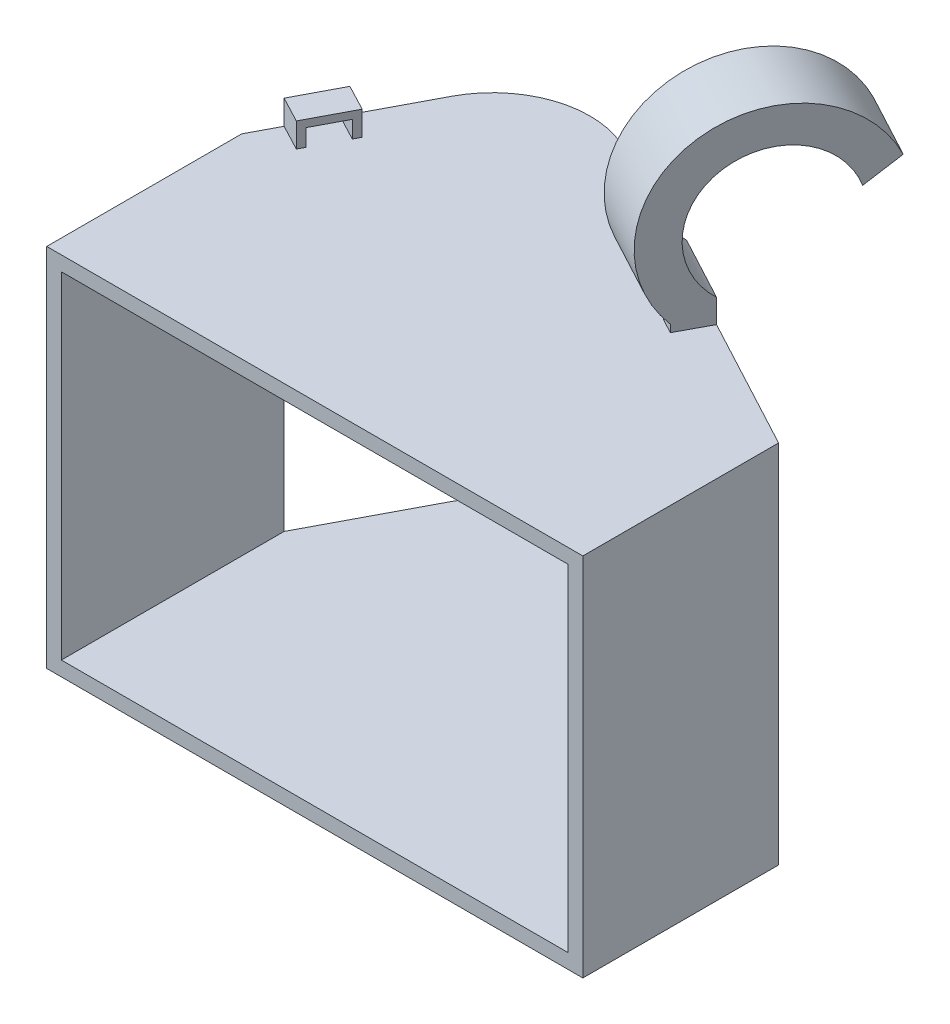
ISO-10303-21;
HEADER;
FILE_DESCRIPTION(('STEP AP214'),'2;1');
FILE_NAME('part.step','',(''),(''),'','','');
FILE_SCHEMA(('AUTOMOTIVE_DESIGN { 1 0 10303 214 1 1 1 1 }'));
ENDSEC;
DATA;
#1=APPLICATION_CONTEXT('core data for automotive mechanical design processes');
#2=APPLICATION_PROTOCOL_DEFINITION('international standard','automotive_design',2000,#1);
#3=PRODUCT_CONTEXT('',#1,'mechanical');
#4=PRODUCT('Part','Part','',(#3));
#5=PRODUCT_RELATED_PRODUCT_CATEGORY('part','',(#4));
#6=PRODUCT_DEFINITION_FORMATION('','',#4);
#7=PRODUCT_DEFINITION_CONTEXT('part definition',#1,'design');
#8=PRODUCT_DEFINITION('design','',#6,#7);
#9=PRODUCT_DEFINITION_SHAPE('','',#8);
#10=(LENGTH_UNIT() NAMED_UNIT(*) SI_UNIT(.MILLI.,.METRE.));
#11=(NAMED_UNIT(*) PLANE_ANGLE_UNIT() SI_UNIT($,.RADIAN.));
#12=(NAMED_UNIT(*) SI_UNIT($,.STERADIAN.) SOLID_ANGLE_UNIT());
#13=UNCERTAINTY_MEASURE_WITH_UNIT(LENGTH_MEASURE(1.E-05),#10,'distance_accuracy_value','');
#14=(GEOMETRIC_REPRESENTATION_CONTEXT(3) GLOBAL_UNCERTAINTY_ASSIGNED_CONTEXT((#13)) GLOBAL_UNIT_ASSIGNED_CONTEXT((#10,
#11,#12)) REPRESENTATION_CONTEXT('',''));
#15=CARTESIAN_POINT('',(0.,0.,0.));
#16=DIRECTION('',(0.,0.,1.));
#17=DIRECTION('',(1.,0.,0.));
#18=AXIS2_PLACEMENT_3D('',#15,#16,#17);
#19=CARTESIAN_POINT('',(-28.9686744744535,3.,-41.2167141231442));
#20=DIRECTION('',(0.,1.,0.));
#21=DIRECTION('',(1.,0.,0.));
#22=AXIS2_PLACEMENT_3D('',#19,#20,#21);
#23=PLANE('',#22);
#24=DIRECTION('',(0.,0.,1.));
#25=VECTOR('',#24,1.);
#26=CARTESIAN_POINT('',(-58.5267086711191,3.,-22.2982702566472));
#27=LINE('',#26,#25);
#28=CARTESIAN_POINT('',(-58.5267086711191,3.,-27.9982702566472));
#29=VERTEX_POINT('',#28);
#30=CARTESIAN_POINT('',(-58.5267086711191,3.,17.7017297433528));
#31=VERTEX_POINT('',#30);
#32=EDGE_CURVE('E331',#29,#31,#27,.T.);
#33=ORIENTED_EDGE('',*,*,#32,.T.);
#34=DIRECTION('',(1.,0.,0.));
#35=VECTOR('',#34,1.);
#36=CARTESIAN_POINT('',(-28.9686744744534,3.,17.7017297433528));
#37=LINE('',#36,#35);
#38=CARTESIAN_POINT('',(45.4732913288809,3.,17.7017297433528));
#39=VERTEX_POINT('',#38);
#40=EDGE_CURVE('E51',#31,#39,#37,.T.);
#41=ORIENTED_EDGE('',*,*,#40,.T.);
#42=DIRECTION('',(0.,0.,-1.));
#43=VECTOR('',#42,1.);
#44=CARTESIAN_POINT('',(45.4732913288809,3.,27.7017297433528));
#45=LINE('',#44,#43);
#46=CARTESIAN_POINT('',(45.4732913288809,3.,-24.0679370185461));
#47=VERTEX_POINT('',#46);
#48=EDGE_CURVE('E514',#39,#47,#45,.T.);
#49=ORIENTED_EDGE('',*,*,#48,.T.);
#50=DIRECTION('',(-0.881715494773685,0.,-0.471781502685296));
#51=VECTOR('',#50,1.);
#52=CARTESIAN_POINT('',(48.4732913288809,3.,-22.4627202377985));
#53=LINE('',#52,#51);
#54=CARTESIAN_POINT('',(-19.5330444207476,3.,-58.8510240186179));
#55=VERTEX_POINT('',#54);
#56=EDGE_CURVE('E386',#47,#55,#53,.T.);
#57=ORIENTED_EDGE('',*,*,#56,.T.);
#58=CARTESIAN_POINT('',(-28.9686744744535,3.,-41.2167141231442));
#59=DIRECTION('',(0.,1.,0.));
#60=DIRECTION('',(0.,0.,1.));
#61=AXIS2_PLACEMENT_3D('',#58,#59,#60);
#62=CIRCLE('',#61,20.);
#63=CARTESIAN_POINT('',(-28.9686744744535,3.,-61.2167141231442));
#64=VERTEX_POINT('',#63);
#65=EDGE_CURVE('E382',#55,#64,#62,.T.);
#66=ORIENTED_EDGE('',*,*,#65,.T.);
#67=CARTESIAN_POINT('',(-28.9686744744535,3.,-41.2167141231442));
#68=DIRECTION('',(0.,1.,0.));
#69=DIRECTION('',(0.,0.,1.));
#70=AXIS2_PLACEMENT_3D('',#67,#68,#69);
#71=CIRCLE('',#70,20.);
#72=CARTESIAN_POINT('',(-46.6670389220931,3.,-50.5316427797967));
#73=VERTEX_POINT('',#72);
#74=EDGE_CURVE('E413',#64,#73,#71,.T.);
#75=ORIENTED_EDGE('',*,*,#74,.T.);
#76=DIRECTION('',(-0.465746432832623,0.,0.884918222381982));
#77=VECTOR('',#76,1.);
#78=CARTESIAN_POINT('',(-46.6670389220931,3.,-50.5316427797967));
#79=LINE('',#78,#77);
#80=EDGE_CURVE('E397',#73,#29,#79,.T.);
#81=ORIENTED_EDGE('',*,*,#80,.T.);
#82=EDGE_LOOP('',(#33,#41,#49,#57,#66,#75,#81));
#83=FACE_BOUND('',#82,.T.);
#84=ADVANCED_FACE('F36',(#83),#23,.T.);
#85=CARTESIAN_POINT('',(-28.9686744744535,72.,-41.2167141231442));
#86=DIRECTION('',(0.,1.,0.));
#87=DIRECTION('',(1.,0.,0.));
#88=AXIS2_PLACEMENT_3D('',#85,#86,#87);
#89=PLANE('',#88);
#90=DIRECTION('',(1.,0.,0.));
#91=VECTOR('',#90,1.);
#92=CARTESIAN_POINT('',(-28.9686744744534,72.,17.7017297433528));
#93=LINE('',#92,#91);
#94=CARTESIAN_POINT('',(-58.5267086711191,72.,17.7017297433528));
#95=VERTEX_POINT('',#94);
#96=CARTESIAN_POINT('',(45.4732913288809,72.,17.7017297433528));
#97=VERTEX_POINT('',#96);
#98=EDGE_CURVE('E1133',#95,#97,#93,.T.);
#99=ORIENTED_EDGE('',*,*,#98,.F.);
#100=DIRECTION('',(0.,0.,1.));
#101=VECTOR('',#100,1.);
#102=CARTESIAN_POINT('',(-58.5267086711191,72.,-22.2982702566472));
#103=LINE('',#102,#101);
#104=CARTESIAN_POINT('',(-58.5267086711191,72.,-27.9982702566472));
#105=VERTEX_POINT('',#104);
#106=EDGE_CURVE('E511',#105,#95,#103,.T.);
#107=ORIENTED_EDGE('',*,*,#106,.F.);
#108=DIRECTION('',(-0.465746432832623,0.,0.884918222381982));
#109=VECTOR('',#108,1.);
#110=CARTESIAN_POINT('',(-46.6670389220931,72.,-50.5316427797967));
#111=LINE('',#110,#109);
#112=CARTESIAN_POINT('',(-46.6670389220931,72.,-50.5316427797967));
#113=VERTEX_POINT('',#112);
#114=EDGE_CURVE('E398',#113,#105,#111,.T.);
#115=ORIENTED_EDGE('',*,*,#114,.F.);
#116=CARTESIAN_POINT('',(-28.9686744744535,72.,-41.2167141231442));
#117=DIRECTION('',(0.,1.,0.));
#118=DIRECTION('',(0.,0.,1.));
#119=AXIS2_PLACEMENT_3D('',#116,#117,#118);
#120=CIRCLE('',#119,20.);
#121=CARTESIAN_POINT('',(-28.9686744744535,72.,-61.2167141231442));
#122=VERTEX_POINT('',#121);
#123=EDGE_CURVE('E414',#122,#113,#120,.T.);
#124=ORIENTED_EDGE('',*,*,#123,.F.);
#125=CARTESIAN_POINT('',(-28.9686744744535,72.,-41.2167141231442));
#126=DIRECTION('',(0.,1.,0.));
#127=DIRECTION('',(0.,0.,1.));
#128=AXIS2_PLACEMENT_3D('',#125,#126,#127);
#129=CIRCLE('',#128,20.);
#130=CARTESIAN_POINT('',(-19.5330444207476,72.,-58.8510240186179));
#131=VERTEX_POINT('',#130);
#132=EDGE_CURVE('E327',#131,#122,#129,.T.);
#133=ORIENTED_EDGE('',*,*,#132,.F.);
#134=DIRECTION('',(-0.881715494773685,0.,-0.471781502685296));
#135=VECTOR('',#134,1.);
#136=CARTESIAN_POINT('',(48.4732913288809,72.,-22.4627202377985));
#137=LINE('',#136,#135);
#138=CARTESIAN_POINT('',(45.4732913288809,72.,-24.0679370185461));
#139=VERTEX_POINT('',#138);
#140=EDGE_CURVE('E424',#139,#131,#137,.T.);
#141=ORIENTED_EDGE('',*,*,#140,.F.);
#142=DIRECTION('',(0.,0.,-1.));
#143=VECTOR('',#142,1.);
#144=CARTESIAN_POINT('',(45.4732913288809,72.,27.7017297433528));
#145=LINE('',#144,#143);
#146=EDGE_CURVE('E527',#97,#139,#145,.T.);
#147=ORIENTED_EDGE('',*,*,#146,.F.);
#148=EDGE_LOOP('',(#99,#107,#115,#124,#133,#141,#147));
#149=FACE_BOUND('',#148,.T.);
#150=ADVANCED_FACE('F649',(#149),#89,.F.);
#151=CARTESIAN_POINT('',(45.4732913288809,75.,27.7017297433528));
#152=DIRECTION('',(-1.,0.,0.));
#153=DIRECTION('',(0.,0.,1.));
#154=AXIS2_PLACEMENT_3D('',#151,#152,#153);
#155=PLANE('',#154);
#156=ORIENTED_EDGE('',*,*,#48,.F.);
#157=DIRECTION('',(0.,1.,0.));
#158=VECTOR('',#157,1.);
#159=CARTESIAN_POINT('',(45.4732913288809,75.,17.7017297433528));
#160=LINE('',#159,#158);
#161=EDGE_CURVE('E752',#39,#97,#160,.T.);
#162=ORIENTED_EDGE('',*,*,#161,.T.);
#163=ORIENTED_EDGE('',*,*,#146,.T.);
#164=DIRECTION('',(0.,-1.,0.));
#165=VECTOR('',#164,1.);
#166=CARTESIAN_POINT('',(45.4732913288809,75.,-24.0679370185461));
#167=LINE('',#166,#165);
#168=EDGE_CURVE('E390',#139,#47,#167,.T.);
#169=ORIENTED_EDGE('',*,*,#168,.T.);
#170=EDGE_LOOP('',(#156,#162,#163,#169));
#171=FACE_BOUND('',#170,.T.);
#172=ADVANCED_FACE('F641',(#171),#155,.T.);
#173=CARTESIAN_POINT('',(-58.5267086711191,75.,-22.2982702566472));
#174=DIRECTION('',(1.,0.,0.));
#175=DIRECTION('',(0.,0.,-1.));
#176=AXIS2_PLACEMENT_3D('',#173,#174,#175);
#177=PLANE('',#176);
#178=ORIENTED_EDGE('',*,*,#106,.T.);
#179=DIRECTION('',(0.,-1.,0.));
#180=VECTOR('',#179,1.);
#181=CARTESIAN_POINT('',(-58.5267086711191,75.,17.7017297433528));
#182=LINE('',#181,#180);
#183=EDGE_CURVE('E321',#95,#31,#182,.T.);
#184=ORIENTED_EDGE('',*,*,#183,.T.);
#185=ORIENTED_EDGE('',*,*,#32,.F.);
#186=DIRECTION('',(0.,-1.,0.));
#187=VECTOR('',#186,1.);
#188=CARTESIAN_POINT('',(-58.5267086711191,75.,-27.9982702566472));
#189=LINE('',#188,#187);
#190=EDGE_CURVE('E370',#105,#29,#189,.T.);
#191=ORIENTED_EDGE('',*,*,#190,.F.);
#192=EDGE_LOOP('',(#178,#184,#185,#191));
#193=FACE_BOUND('',#192,.T.);
#194=ADVANCED_FACE('F833',(#193),#177,.T.);
#195=CARTESIAN_POINT('',(-28.9686744744535,0.,-41.2167141231442));
#196=DIRECTION('',(0.,1.,0.));
#197=DIRECTION('',(1.,0.,0.));
#198=AXIS2_PLACEMENT_3D('',#195,#196,#197);
#199=PLANE('',#198);
#200=DIRECTION('',(-1.,0.,0.));
#201=VECTOR('',#200,1.);
#202=CARTESIAN_POINT('',(0.,0.,17.7017297433528));
#203=LINE('',#202,#201);
#204=CARTESIAN_POINT('',(48.4732913288809,0.,17.7017297433528));
#205=VERTEX_POINT('',#204);
#206=CARTESIAN_POINT('',(-61.5267086711192,0.,17.7017297433528));
#207=VERTEX_POINT('',#206);
#208=EDGE_CURVE('E306',#205,#207,#203,.T.);
#209=ORIENTED_EDGE('',*,*,#208,.T.);
#210=DIRECTION('',(0.,0.,1.));
#211=VECTOR('',#210,1.);
#212=CARTESIAN_POINT('',(-61.5267086711192,0.,-22.2982702566472));
#213=LINE('',#212,#211);
#214=CARTESIAN_POINT('',(-61.5267086711192,0.,-22.2982702566472));
#215=VERTEX_POINT('',#214);
#216=EDGE_CURVE('E328',#215,#207,#213,.T.);
#217=ORIENTED_EDGE('',*,*,#216,.F.);
#218=DIRECTION('',(-0.465746432832623,0.,0.884918222381982));
#219=VECTOR('',#218,1.);
#220=CARTESIAN_POINT('',(-46.6670389220931,0.,-50.5316427797967));
#221=LINE('',#220,#219);
#222=CARTESIAN_POINT('',(-46.6670389220931,0.,-50.5316427797967));
#223=VERTEX_POINT('',#222);
#224=EDGE_CURVE('E392',#223,#215,#221,.T.);
#225=ORIENTED_EDGE('',*,*,#224,.F.);
#226=CARTESIAN_POINT('',(-28.9686744744535,0.,-41.2167141231442));
#227=DIRECTION('',(0.,1.,0.));
#228=DIRECTION('',(0.,0.,1.));
#229=AXIS2_PLACEMENT_3D('',#226,#227,#228);
#230=CIRCLE('',#229,20.);
#231=CARTESIAN_POINT('',(-28.9686744744535,0.,-61.2167141231442));
#232=VERTEX_POINT('',#231);
#233=EDGE_CURVE('E520',#232,#223,#230,.T.);
#234=ORIENTED_EDGE('',*,*,#233,.F.);
#235=CARTESIAN_POINT('',(-28.9686744744535,0.,-41.2167141231442));
#236=DIRECTION('',(0.,1.,0.));
#237=DIRECTION('',(0.,0.,1.));
#238=AXIS2_PLACEMENT_3D('',#235,#236,#237);
#239=CIRCLE('',#238,20.);
#240=CARTESIAN_POINT('',(-19.5330444207476,0.,-58.8510240186179));
#241=VERTEX_POINT('',#240);
#242=EDGE_CURVE('E334',#241,#232,#239,.T.);
#243=ORIENTED_EDGE('',*,*,#242,.F.);
#244=DIRECTION('',(-0.881715494773685,0.,-0.471781502685296));
#245=VECTOR('',#244,1.);
#246=CARTESIAN_POINT('',(48.4732913288809,0.,-22.4627202377985));
#247=LINE('',#246,#245);
#248=CARTESIAN_POINT('',(48.4732913288809,0.,-22.4627202377985));
#249=VERTEX_POINT('',#248);
#250=EDGE_CURVE('E325',#249,#241,#247,.T.);
#251=ORIENTED_EDGE('',*,*,#250,.F.);
#252=DIRECTION('',(0.,0.,-1.));
#253=VECTOR('',#252,1.);
#254=CARTESIAN_POINT('',(48.4732913288809,0.,27.7017297433528));
#255=LINE('',#254,#253);
#256=EDGE_CURVE('E318',#205,#249,#255,.T.);
#257=ORIENTED_EDGE('',*,*,#256,.F.);
#258=EDGE_LOOP('',(#209,#217,#225,#234,#243,#251,#257));
#259=FACE_BOUND('',#258,.T.);
#260=ADVANCED_FACE('F323',(#259),#199,.F.);
#261=CARTESIAN_POINT('',(48.4732913288809,75.,27.7017297433528));
#262=DIRECTION('',(-1.,0.,0.));
#263=DIRECTION('',(0.,0.,1.));
#264=AXIS2_PLACEMENT_3D('',#261,#262,#263);
#265=PLANE('',#264);
#266=DIRECTION('',(0.,-1.,0.));
#267=VECTOR('',#266,1.);
#268=CARTESIAN_POINT('',(48.4732913288809,112.113709153502,17.7017297433528));
#269=LINE('',#268,#267);
#270=CARTESIAN_POINT('',(48.4732913288809,75.,17.7017297433528));
#271=VERTEX_POINT('',#270);
#272=EDGE_CURVE('E59',#271,#205,#269,.T.);
#273=ORIENTED_EDGE('',*,*,#272,.T.);
#274=ORIENTED_EDGE('',*,*,#256,.T.);
#275=DIRECTION('',(0.,-1.,0.));
#276=VECTOR('',#275,1.);
#277=CARTESIAN_POINT('',(48.4732913288809,75.,-22.4627202377985));
#278=LINE('',#277,#276);
#279=CARTESIAN_POINT('',(48.4732913288809,75.,-22.4627202377985));
#280=VERTEX_POINT('',#279);
#281=EDGE_CURVE('E348',#280,#249,#278,.T.);
#282=ORIENTED_EDGE('',*,*,#281,.F.);
#283=DIRECTION('',(0.,0.,-1.));
#284=VECTOR('',#283,1.);
#285=CARTESIAN_POINT('',(48.4732913288809,75.,27.7017297433528));
#286=LINE('',#285,#284);
#287=EDGE_CURVE('E320',#271,#280,#286,.T.);
#288=ORIENTED_EDGE('',*,*,#287,.F.);
#289=EDGE_LOOP('',(#273,#274,#282,#288));
#290=FACE_BOUND('',#289,.T.);
#291=ADVANCED_FACE('F316',(#290),#265,.F.);
#292=CARTESIAN_POINT('',(-61.5267086711192,75.,-22.2982702566472));
#293=DIRECTION('',(1.,0.,0.));
#294=DIRECTION('',(0.,0.,-1.));
#295=AXIS2_PLACEMENT_3D('',#292,#293,#294);
#296=PLANE('',#295);
#297=DIRECTION('',(0.,-1.,0.));
#298=VECTOR('',#297,1.);
#299=CARTESIAN_POINT('',(-61.5267086711192,112.113709153502,17.7017297433528));
#300=LINE('',#299,#298);
#301=CARTESIAN_POINT('',(-61.5267086711192,75.,17.7017297433528));
#302=VERTEX_POINT('',#301);
#303=EDGE_CURVE('E309',#302,#207,#300,.T.);
#304=ORIENTED_EDGE('',*,*,#303,.F.);
#305=DIRECTION('',(0.,0.,1.));
#306=VECTOR('',#305,1.);
#307=CARTESIAN_POINT('',(-61.5267086711192,75.,-22.2982702566472));
#308=LINE('',#307,#306);
#309=CARTESIAN_POINT('',(-61.5267086711192,75.,-22.2982702566472));
#310=VERTEX_POINT('',#309);
#311=EDGE_CURVE('E448',#310,#302,#308,.T.);
#312=ORIENTED_EDGE('',*,*,#311,.F.);
#313=DIRECTION('',(0.,-1.,0.));
#314=VECTOR('',#313,1.);
#315=CARTESIAN_POINT('',(-61.5267086711192,75.,-22.2982702566472));
#316=LINE('',#315,#314);
#317=EDGE_CURVE('E396',#310,#215,#316,.T.);
#318=ORIENTED_EDGE('',*,*,#317,.T.);
#319=ORIENTED_EDGE('',*,*,#216,.T.);
#320=EDGE_LOOP('',(#304,#312,#318,#319));
#321=FACE_BOUND('',#320,.T.);
#322=ADVANCED_FACE('F856',(#321),#296,.F.);
#323=CARTESIAN_POINT('',(-28.9686744744535,75.,-41.2167141231442));
#324=DIRECTION('',(0.,1.,0.));
#325=DIRECTION('',(1.,0.,0.));
#326=AXIS2_PLACEMENT_3D('',#323,#324,#325);
#327=PLANE('',#326);
#328=ORIENTED_EDGE('',*,*,#311,.T.);
#329=DIRECTION('',(1.,0.,0.));
#330=VECTOR('',#329,1.);
#331=CARTESIAN_POINT('',(-28.9686744744534,75.,17.7017297433528));
#332=LINE('',#331,#330);
#333=EDGE_CURVE('E11',#302,#271,#332,.T.);
#334=ORIENTED_EDGE('',*,*,#333,.T.);
#335=ORIENTED_EDGE('',*,*,#287,.T.);
#336=DIRECTION('',(-0.881715494773685,0.,-0.471781502685296));
#337=VECTOR('',#336,1.);
#338=CARTESIAN_POINT('',(48.4732913288809,75.,-22.4627202377985));
#339=LINE('',#338,#337);
#340=CARTESIAN_POINT('',(21.0829889989737,75.,-37.1185112143707));
#341=VERTEX_POINT('',#340);
#342=EDGE_CURVE('E349',#280,#341,#339,.T.);
#343=ORIENTED_EDGE('',*,*,#342,.T.);
#344=DIRECTION('',(0.471781502685296,0.,-0.881715494773685));
#345=VECTOR('',#344,1.);
#346=CARTESIAN_POINT('',(0.949934773429886,75.,0.508283746308439));
#347=LINE('',#346,#345);
#348=CARTESIAN_POINT('',(17.7805184801765,75.,-30.9465027509549));
#349=VERTEX_POINT('',#348);
#350=EDGE_CURVE('E353',#349,#341,#347,.T.);
#351=ORIENTED_EDGE('',*,*,#350,.F.);
#352=DIRECTION('',(0.881715494773685,0.,0.471781502685296));
#353=VECTOR('',#352,1.);
#354=CARTESIAN_POINT('',(16.8305837067467,75.,-31.4547864972634));
#355=LINE('',#354,#353);
#356=CARTESIAN_POINT('',(14.794090655897,75.,-32.5444574369633));
#357=VERTEX_POINT('',#356);
#358=EDGE_CURVE('E458',#357,#349,#355,.T.);
#359=ORIENTED_EDGE('',*,*,#358,.F.);
#360=DIRECTION('',(0.471781502685296,0.,-0.881715494773685));
#361=VECTOR('',#360,1.);
#362=CARTESIAN_POINT('',(13.8505276505264,75.,-30.781026447416));
#363=LINE('',#362,#361);
#364=CARTESIAN_POINT('',(18.0965611746941,75.,-38.7164659003791));
#365=VERTEX_POINT('',#364);
#366=EDGE_CURVE('E453',#357,#365,#363,.T.);
#367=ORIENTED_EDGE('',*,*,#366,.T.);
#368=DIRECTION('',(-0.881715494773685,0.,-0.471781502685296));
#369=VECTOR('',#368,1.);
#370=CARTESIAN_POINT('',(14.7901280692927,75.,-40.485646535449));
#371=LINE('',#370,#369);
#372=CARTESIAN_POINT('',(11.4836949638914,75.,-42.2548271705189));
#373=VERTEX_POINT('',#372);
#374=EDGE_CURVE('E457',#365,#373,#371,.T.);
#375=ORIENTED_EDGE('',*,*,#374,.T.);
#376=DIRECTION('',(0.471781502685296,0.,-0.881715494773685));
#377=VECTOR('',#376,1.);
#378=CARTESIAN_POINT('',(7.23766143972373,75.,-34.3193877175557));
#379=LINE('',#378,#377);
#380=CARTESIAN_POINT('',(8.18122444509432,75.,-36.0828187071031));
#381=VERTEX_POINT('',#380);
#382=EDGE_CURVE('E488',#381,#373,#379,.T.);
#383=ORIENTED_EDGE('',*,*,#382,.F.);
#384=DIRECTION('',(0.881715494773685,0.,0.471781502685296));
#385=VECTOR('',#384,1.);
#386=CARTESIAN_POINT('',(16.8305837067467,75.,-31.4547864972634));
#387=LINE('',#386,#385);
#388=CARTESIAN_POINT('',(4.55478739036262,75.,-38.0232245786299));
#389=VERTEX_POINT('',#388);
#390=EDGE_CURVE('E519',#389,#381,#387,.T.);
#391=ORIENTED_EDGE('',*,*,#390,.F.);
#392=DIRECTION('',(-0.471781502685295,0.,0.881715494773686));
#393=VECTOR('',#392,1.);
#394=CARTESIAN_POINT('',(-12.275796316384,75.,-6.56843808136637));
#395=LINE('',#394,#393);
#396=CARTESIAN_POINT('',(7.85725790915968,75.,-44.1952330420456));
#397=VERTEX_POINT('',#396);
#398=EDGE_CURVE('E338',#397,#389,#395,.T.);
#399=ORIENTED_EDGE('',*,*,#398,.F.);
#400=DIRECTION('',(-0.881715494773685,0.,-0.471781502685296));
#401=VECTOR('',#400,1.);
#402=CARTESIAN_POINT('',(48.4732913288809,75.,-22.4627202377985));
#403=LINE('',#402,#401);
#404=CARTESIAN_POINT('',(-19.5330444207476,75.,-58.8510240186179));
#405=VERTEX_POINT('',#404);
#406=EDGE_CURVE('E344',#397,#405,#403,.T.);
#407=ORIENTED_EDGE('',*,*,#406,.T.);
#408=CARTESIAN_POINT('',(-28.9686744744535,75.,-41.2167141231442));
#409=DIRECTION('',(0.,1.,0.));
#410=DIRECTION('',(0.,0.,1.));
#411=AXIS2_PLACEMENT_3D('',#408,#409,#410);
#412=CIRCLE('',#411,20.);
#413=CARTESIAN_POINT('',(-28.9686744744535,75.,-61.2167141231442));
#414=VERTEX_POINT('',#413);
#415=EDGE_CURVE('E340',#405,#414,#412,.T.);
#416=ORIENTED_EDGE('',*,*,#415,.T.);
#417=CARTESIAN_POINT('',(-28.9686744744535,75.,-41.2167141231442));
#418=DIRECTION('',(0.,1.,0.));
#419=DIRECTION('',(0.,0.,1.));
#420=AXIS2_PLACEMENT_3D('',#417,#418,#419);
#421=CIRCLE('',#420,20.);
#422=CARTESIAN_POINT('',(-46.6670389220931,75.,-50.5316427797967));
#423=VERTEX_POINT('',#422);
#424=EDGE_CURVE('E672',#414,#423,#421,.T.);
#425=ORIENTED_EDGE('',*,*,#424,.T.);
#426=DIRECTION('',(-0.465746432832623,0.,0.884918222381982));
#427=VECTOR('',#426,1.);
#428=CARTESIAN_POINT('',(-46.6670389220931,75.,-50.5316427797967));
#429=LINE('',#428,#427);
#430=CARTESIAN_POINT('',(-53.8692443427929,75.,-36.847452480467));
#431=VERTEX_POINT('',#430);
#432=EDGE_CURVE('E343',#423,#431,#429,.T.);
#433=ORIENTED_EDGE('',*,*,#432,.T.);
#434=DIRECTION('',(-0.884918222381983,0.,-0.465746432832621));
#435=VECTOR('',#434,1.);
#436=CARTESIAN_POINT('',(-48.559735008501,75.,-34.0529738834713));
#437=LINE('',#436,#435);
#438=CARTESIAN_POINT('',(-48.559735008501,75.,-34.0529738834713));
#439=VERTEX_POINT('',#438);
#440=EDGE_CURVE('E474',#439,#431,#437,.T.);
#441=ORIENTED_EDGE('',*,*,#440,.F.);
#442=DIRECTION('',(0.465746432832622,0.,-0.884918222381983));
#443=VECTOR('',#442,1.);
#444=CARTESIAN_POINT('',(-53.2171993368273,75.,-25.2037916596515));
#445=LINE('',#444,#443);
#446=CARTESIAN_POINT('',(-49.25835465775,75.,-32.7255965498983));
#447=VERTEX_POINT('',#446);
#448=EDGE_CURVE('E470',#447,#439,#445,.T.);
#449=ORIENTED_EDGE('',*,*,#448,.F.);
#450=DIRECTION('',(0.884918222381983,0.,0.465746432832622));
#451=VECTOR('',#450,1.);
#452=CARTESIAN_POINT('',(-62.5321279934797,75.,-39.7117930423877));
#453=LINE('',#452,#451);
#454=CARTESIAN_POINT('',(-54.5678639920419,75.,-35.5200751468941));
#455=VERTEX_POINT('',#454);
#456=EDGE_CURVE('E434',#455,#447,#453,.T.);
#457=ORIENTED_EDGE('',*,*,#456,.F.);
#458=DIRECTION('',(0.465746432832623,0.,-0.884918222381982));
#459=VECTOR('',#458,1.);
#460=CARTESIAN_POINT('',(-46.6670389220931,75.,-50.5316427797967));
#461=LINE('',#460,#459);
#462=CARTESIAN_POINT('',(-57.8280890218702,75.,-29.3256475902202));
#463=VERTEX_POINT('',#462);
#464=EDGE_CURVE('E429',#463,#455,#461,.T.);
#465=ORIENTED_EDGE('',*,*,#464,.F.);
#466=DIRECTION('',(0.884918222381983,0.,0.465746432832622));
#467=VECTOR('',#466,1.);
#468=CARTESIAN_POINT('',(-65.7923530233081,75.,-33.5173654857138));
#469=LINE('',#468,#467);
#470=CARTESIAN_POINT('',(-52.5185796875783,75.,-26.5311689932244));
#471=VERTEX_POINT('',#470);
#472=EDGE_CURVE('E433',#463,#471,#469,.T.);
#473=ORIENTED_EDGE('',*,*,#472,.T.);
#474=DIRECTION('',(0.465746432832622,0.,-0.884918222381983));
#475=VECTOR('',#474,1.);
#476=CARTESIAN_POINT('',(-53.2171993368273,75.,-25.2037916596515));
#477=LINE('',#476,#475);
#478=CARTESIAN_POINT('',(-53.2171993368273,75.,-25.2037916596515));
#479=VERTEX_POINT('',#478);
#480=EDGE_CURVE('E556',#479,#471,#477,.T.);
#481=ORIENTED_EDGE('',*,*,#480,.F.);
#482=DIRECTION('',(0.884918222381983,0.,0.465746432832621));
#483=VECTOR('',#482,1.);
#484=CARTESIAN_POINT('',(-58.5267086711191,75.,-27.9982702566472));
#485=LINE('',#484,#483);
#486=CARTESIAN_POINT('',(-58.5267086711191,75.,-27.9982702566472));
#487=VERTEX_POINT('',#486);
#488=EDGE_CURVE('E560',#487,#479,#485,.T.);
#489=ORIENTED_EDGE('',*,*,#488,.F.);
#490=DIRECTION('',(-0.465746432832623,0.,0.884918222381982));
#491=VECTOR('',#490,1.);
#492=CARTESIAN_POINT('',(-46.6670389220931,75.,-50.5316427797967));
#493=LINE('',#492,#491);
#494=EDGE_CURVE('E452',#487,#310,#493,.T.);
#495=ORIENTED_EDGE('',*,*,#494,.T.);
#496=EDGE_LOOP('',(#328,#334,#335,#343,#351,#359,#367,#375,#383,#391,#399,#407,#416,#425,#433,
#441,#449,#457,#465,#473,#481,#489,#495));
#497=FACE_BOUND('',#496,.T.);
#498=ADVANCED_FACE('F631',(#497),#327,.T.);
#499=CARTESIAN_POINT('',(13.8505276505264,77.5,-30.781026447416));
#500=DIRECTION('',(0.,1.,0.));
#501=DIRECTION('',(1.,0.,0.));
#502=AXIS2_PLACEMENT_3D('',#499,#500,#501);
#503=PLANE('',#502);
#504=DIRECTION('',(-0.881715494773685,0.,-0.471781502685296));
#505=VECTOR('',#504,1.);
#506=CARTESIAN_POINT('',(4.15454227911853,77.5,-37.2752071090428));
#507=LINE('',#506,#505);
#508=CARTESIAN_POINT('',(14.3938468764442,77.5,-31.7964392547717));
#509=VERTEX_POINT('',#508);
#510=CARTESIAN_POINT('',(7.78098066564156,77.5,-35.3348005249115));
#511=VERTEX_POINT('',#510);
#512=EDGE_CURVE('E360',#509,#511,#507,.T.);
#513=ORIENTED_EDGE('',*,*,#512,.T.);
#514=DIRECTION('',(0.471781502685296,0.,-0.881715494773685));
#515=VECTOR('',#514,1.);
#516=CARTESIAN_POINT('',(7.23766143972373,77.5,-34.3193877175557));
#517=LINE('',#516,#515);
#518=CARTESIAN_POINT('',(11.4836949638914,77.5,-42.2548271705189));
#519=VERTEX_POINT('',#518);
#520=EDGE_CURVE('E469',#511,#519,#517,.T.);
#521=ORIENTED_EDGE('',*,*,#520,.T.);
#522=DIRECTION('',(0.881715494773685,0.,0.471781502685296));
#523=VECTOR('',#522,1.);
#524=CARTESIAN_POINT('',(18.0965611746941,77.5,-38.7164659003791));
#525=LINE('',#524,#523);
#526=CARTESIAN_POINT('',(18.0965611746941,77.5,-38.7164659003791));
#527=VERTEX_POINT('',#526);
#528=EDGE_CURVE('E487',#519,#527,#525,.T.);
#529=ORIENTED_EDGE('',*,*,#528,.T.);
#530=DIRECTION('',(0.471781502685296,0.,-0.881715494773685));
#531=VECTOR('',#530,1.);
#532=CARTESIAN_POINT('',(13.8505276505264,77.5,-30.781026447416));
#533=LINE('',#532,#531);
#534=EDGE_CURVE('E44',#509,#527,#533,.T.);
#535=ORIENTED_EDGE('',*,*,#534,.F.);
#536=EDGE_LOOP('',(#513,#521,#529,#535));
#537=FACE_BOUND('',#536,.T.);
#538=ADVANCED_FACE('F38',(#537),#503,.F.);
#539=CARTESIAN_POINT('',(13.8505276505264,75.,-30.781026447416));
#540=DIRECTION('',(0.881715494773685,0.,0.471781502685296));
#541=DIRECTION('',(0.,-1.,0.));
#542=AXIS2_PLACEMENT_3D('',#539,#540,#541);
#543=PLANE('',#542);
#544=CARTESIAN_POINT('',(22.2620970793122,90.7889800627934,-46.5014628327153));
#545=DIRECTION('',(-0.881715494773685,0.,-0.471781502685296));
#546=DIRECTION('',(0.471781502685296,0.,-0.881715494773685));
#547=AXIS2_PLACEMENT_3D('',#544,#545,#546);
#548=CIRCLE('',#547,21.324729090709);
#549=CARTESIAN_POINT('',(14.794090655897,76.5,-32.5444574369633));
#550=VERTEX_POINT('',#549);
#551=EDGE_CURVE('E364',#550,#509,#548,.T.);
#552=ORIENTED_EDGE('',*,*,#551,.T.);
#553=ORIENTED_EDGE('',*,*,#534,.T.);
#554=DIRECTION('',(0.,-1.,0.));
#555=VECTOR('',#554,1.);
#556=CARTESIAN_POINT('',(18.0965611746941,75.,-38.7164659003791));
#557=LINE('',#556,#555);
#558=EDGE_CURVE('E441',#527,#365,#557,.T.);
#559=ORIENTED_EDGE('',*,*,#558,.T.);
#560=ORIENTED_EDGE('',*,*,#366,.F.);
#561=DIRECTION('',(0.,-1.,0.));
#562=VECTOR('',#561,1.);
#563=CARTESIAN_POINT('',(14.794090655897,76.5,-32.5444574369633));
#564=LINE('',#563,#562);
#565=EDGE_CURVE('E358',#550,#357,#564,.T.);
#566=ORIENTED_EDGE('',*,*,#565,.F.);
#567=EDGE_LOOP('',(#552,#553,#559,#560,#566));
#568=FACE_BOUND('',#567,.T.);
#569=ADVANCED_FACE('F704',(#568),#543,.F.);
#570=CARTESIAN_POINT('',(7.23766143972373,77.5,-34.3193877175557));
#571=DIRECTION('',(-0.881715494773685,0.,-0.471781502685296));
#572=DIRECTION('',(-0.471781502685296,0.,0.881715494773685));
#573=AXIS2_PLACEMENT_3D('',#570,#571,#572);
#574=PLANE('',#573);
#575=ORIENTED_EDGE('',*,*,#382,.T.);
#576=DIRECTION('',(0.,1.,0.));
#577=VECTOR('',#576,1.);
#578=CARTESIAN_POINT('',(11.4836949638914,77.5,-42.2548271705189));
#579=LINE('',#578,#577);
#580=EDGE_CURVE('E483',#373,#519,#579,.T.);
#581=ORIENTED_EDGE('',*,*,#580,.T.);
#582=ORIENTED_EDGE('',*,*,#520,.F.);
#583=CARTESIAN_POINT('',(15.6492308685095,90.7889800627934,-50.0398241028551));
#584=DIRECTION('',(0.881715494773685,0.,0.471781502685296));
#585=DIRECTION('',(-0.471781502685296,0.,0.881715494773685));
#586=AXIS2_PLACEMENT_3D('',#583,#584,#585);
#587=CIRCLE('',#586,21.324729090709);
#588=CARTESIAN_POINT('',(8.18122444509432,76.5,-36.0828187071031));
#589=VERTEX_POINT('',#588);
#590=EDGE_CURVE('E365',#511,#589,#587,.T.);
#591=ORIENTED_EDGE('',*,*,#590,.T.);
#592=DIRECTION('',(0.,1.,0.));
#593=VECTOR('',#592,1.);
#594=CARTESIAN_POINT('',(8.18122444509432,76.5,-36.0828187071031));
#595=LINE('',#594,#593);
#596=EDGE_CURVE('E447',#381,#589,#595,.T.);
#597=ORIENTED_EDGE('',*,*,#596,.F.);
#598=EDGE_LOOP('',(#575,#581,#582,#591,#597));
#599=FACE_BOUND('',#598,.T.);
#600=ADVANCED_FACE('F709',(#599),#574,.F.);
#601=CARTESIAN_POINT('',(12.0227924819865,90.7889800627934,-51.9802306869864));
#602=DIRECTION('',(0.881715494773685,0.,0.471781502685296));
#603=DIRECTION('',(0.471781502685296,0.,-0.881715494773685));
#604=AXIS2_PLACEMENT_3D('',#601,#602,#603);
#605=CYLINDRICAL_SURFACE('',#604,14.05);
#606=CARTESIAN_POINT('',(25.2485249035918,90.7889800627934,-44.903508146707));
#607=DIRECTION('',(-0.881715494773685,0.,-0.471781502685296));
#608=DIRECTION('',(0.471781502685296,0.,-0.881715494773685));
#609=AXIS2_PLACEMENT_3D('',#606,#607,#608);
#610=CIRCLE('',#609,14.05);
#611=CARTESIAN_POINT('',(21.0829889989737,79.8599072114097,-37.1185112143707));
#612=VERTEX_POINT('',#611);
#613=CARTESIAN_POINT('',(31.5402076598245,95.2108961499042,-56.6620746500471));
#614=VERTEX_POINT('',#613);
#615=EDGE_CURVE('E496',#612,#614,#610,.T.);
#616=ORIENTED_EDGE('',*,*,#615,.F.);
#617=DIRECTION('',(0.881715494773685,0.,0.471781502685296));
#618=VECTOR('',#617,1.);
#619=CARTESIAN_POINT('',(7.85725657736834,79.8599072114097,-44.1952337546502));
#620=LINE('',#619,#618);
#621=CARTESIAN_POINT('',(7.85725657736834,79.8599072114097,-44.1952337546502));
#622=VERTEX_POINT('',#621);
#623=EDGE_CURVE('E478',#622,#612,#620,.T.);
#624=ORIENTED_EDGE('',*,*,#623,.F.);
#625=CARTESIAN_POINT('',(12.0227924819865,90.7889800627934,-51.9802306869864));
#626=DIRECTION('',(-0.881715494773685,0.,-0.471781502685296));
#627=DIRECTION('',(0.471781502685296,0.,-0.881715494773685));
#628=AXIS2_PLACEMENT_3D('',#625,#626,#627);
#629=CIRCLE('',#628,14.05);
#630=CARTESIAN_POINT('',(18.3144752382193,95.2108961499042,-63.7387971903266));
#631=VERTEX_POINT('',#630);
#632=EDGE_CURVE('E417',#622,#631,#629,.T.);
#633=ORIENTED_EDGE('',*,*,#632,.T.);
#634=DIRECTION('',(0.881715494773685,0.,0.471781502685296));
#635=VECTOR('',#634,1.);
#636=CARTESIAN_POINT('',(18.3144752382193,95.2108961499042,-63.7387971903266));
#637=LINE('',#636,#635);
#638=EDGE_CURVE('E428',#631,#614,#637,.T.);
#639=ORIENTED_EDGE('',*,*,#638,.T.);
#640=EDGE_LOOP('',(#616,#624,#633,#639));
#641=FACE_BOUND('',#640,.T.);
#642=ADVANCED_FACE('F686',(#641),#605,.F.);
#643=CARTESIAN_POINT('',(18.3144752382193,95.2108961499042,-63.7387971903266));
#644=DIRECTION('',(0.268610422713736,-0.822092852047623,-0.502007752352245));
#645=DIRECTION('',(0.,0.521160992802402,-0.853458387726792));
#646=AXIS2_PLACEMENT_3D('',#643,#644,#645);
#647=PLANE('',#646);
#648=DIRECTION('',(0.387848201085868,0.569353442610304,-0.72485200579308));
#649=VECTOR('',#648,1.);
#650=CARTESIAN_POINT('',(31.5402076598245,95.2108961499042,-56.6620746500471));
#651=LINE('',#650,#649);
#652=CARTESIAN_POINT('',(34.4386689638122,99.4657796767012,-62.0790276848348));
#653=VERTEX_POINT('',#652);
#654=EDGE_CURVE('E466',#614,#653,#651,.T.);
#655=ORIENTED_EDGE('',*,*,#654,.F.);
#656=ORIENTED_EDGE('',*,*,#638,.F.);
#657=DIRECTION('',(0.387848201085868,0.569353442610304,-0.72485200579308));
#658=VECTOR('',#657,1.);
#659=CARTESIAN_POINT('',(18.3144752382193,95.2108961499042,-63.7387971903266));
#660=LINE('',#659,#658);
#661=CARTESIAN_POINT('',(21.2129365422069,99.4657796767012,-69.1557502251143));
#662=VERTEX_POINT('',#661);
#663=EDGE_CURVE('E596',#631,#662,#660,.T.);
#664=ORIENTED_EDGE('',*,*,#663,.T.);
#665=DIRECTION('',(0.881715494773685,0.,0.471781502685296));
#666=VECTOR('',#665,1.);
#667=CARTESIAN_POINT('',(21.2129365422069,99.4657796767012,-69.1557502251143));
#668=LINE('',#667,#666);
#669=EDGE_CURVE('E425',#662,#653,#668,.T.);
#670=ORIENTED_EDGE('',*,*,#669,.T.);
#671=EDGE_LOOP('',(#655,#656,#664,#670));
#672=FACE_BOUND('',#671,.T.);
#673=ADVANCED_FACE('F692',(#672),#647,.T.);
#674=CARTESIAN_POINT('',(12.0227924819865,90.7889800627934,-51.9802306869864));
#675=DIRECTION('',(0.881715494773685,0.,0.471781502685296));
#676=DIRECTION('',(0.471781502685296,0.,-0.881715494773685));
#677=AXIS2_PLACEMENT_3D('',#674,#675,#676);
#678=CYLINDRICAL_SURFACE('',#677,21.324729090709);
#679=ORIENTED_EDGE('',*,*,#590,.F.);
#680=ORIENTED_EDGE('',*,*,#512,.F.);
#681=ORIENTED_EDGE('',*,*,#551,.F.);
#682=DIRECTION('',(0.881715494773685,0.,0.471781502685296));
#683=VECTOR('',#682,1.);
#684=CARTESIAN_POINT('',(16.8305837067467,76.5,-31.4547864972634));
#685=LINE('',#684,#683);
#686=CARTESIAN_POINT('',(17.7805184801765,76.5,-30.9465027509549));
#687=VERTEX_POINT('',#686);
#688=EDGE_CURVE('E354',#550,#687,#685,.T.);
#689=ORIENTED_EDGE('',*,*,#688,.T.);
#690=CARTESIAN_POINT('',(25.2485249035918,90.7889800627934,-44.903508146707));
#691=DIRECTION('',(0.881715494773685,0.,0.471781502685296));
#692=DIRECTION('',(0.471781502685296,0.,-0.881715494773685));
#693=AXIS2_PLACEMENT_3D('',#690,#691,#692);
#694=CIRCLE('',#693,21.324729090709);
#695=EDGE_CURVE('E462',#653,#687,#694,.T.);
#696=ORIENTED_EDGE('',*,*,#695,.F.);
#697=ORIENTED_EDGE('',*,*,#669,.F.);
#698=CARTESIAN_POINT('',(12.0227924819865,90.7889800627934,-51.9802306869864));
#699=DIRECTION('',(0.881715494773685,0.,0.471781502685296));
#700=DIRECTION('',(0.471781502685296,0.,-0.881715494773685));
#701=AXIS2_PLACEMENT_3D('',#698,#699,#700);
#702=CIRCLE('',#701,21.324729090709);
#703=CARTESIAN_POINT('',(4.55478739036262,76.5,-38.0232245786299));
#704=VERTEX_POINT('',#703);
#705=EDGE_CURVE('E465',#662,#704,#702,.T.);
#706=ORIENTED_EDGE('',*,*,#705,.T.);
#707=DIRECTION('',(0.881715494773685,0.,0.471781502685296));
#708=VECTOR('',#707,1.);
#709=CARTESIAN_POINT('',(16.8305837067467,76.5,-31.4547864972634));
#710=LINE('',#709,#708);
#711=EDGE_CURVE('E442',#704,#589,#710,.T.);
#712=ORIENTED_EDGE('',*,*,#711,.T.);
#713=EDGE_LOOP('',(#679,#680,#681,#689,#696,#697,#706,#712));
#714=FACE_BOUND('',#713,.T.);
#715=ADVANCED_FACE('F696',(#714),#678,.T.);
#716=CARTESIAN_POINT('',(-12.275796316384,76.5,-6.56843808136637));
#717=DIRECTION('',(0.881715494773686,0.,0.471781502685295));
#718=DIRECTION('',(0.,-1.,0.));
#719=AXIS2_PLACEMENT_3D('',#716,#717,#718);
#720=PLANE('',#719);
#721=ORIENTED_EDGE('',*,*,#398,.T.);
#722=DIRECTION('',(0.,-1.,0.));
#723=VECTOR('',#722,1.);
#724=CARTESIAN_POINT('',(4.55478739036262,76.5,-38.0232245786299));
#725=LINE('',#724,#723);
#726=EDGE_CURVE('E446',#704,#389,#725,.T.);
#727=ORIENTED_EDGE('',*,*,#726,.F.);
#728=ORIENTED_EDGE('',*,*,#705,.F.);
#729=ORIENTED_EDGE('',*,*,#663,.F.);
#730=ORIENTED_EDGE('',*,*,#632,.F.);
#731=DIRECTION('',(0.,-1.,0.));
#732=VECTOR('',#731,1.);
#733=CARTESIAN_POINT('',(7.85725790915967,76.5,-44.1952330420456));
#734=LINE('',#733,#732);
#735=EDGE_CURVE('E482',#622,#397,#734,.T.);
#736=ORIENTED_EDGE('',*,*,#735,.T.);
#737=EDGE_LOOP('',(#721,#727,#728,#729,#730,#736));
#738=FACE_BOUND('',#737,.T.);
#739=ADVANCED_FACE('F689',(#738),#720,.F.);
#740=CARTESIAN_POINT('',(0.949934773429886,76.5,0.508283746308439));
#741=DIRECTION('',(-0.881715494773685,0.,-0.471781502685296));
#742=DIRECTION('',(-0.471781502685296,0.,0.881715494773685));
#743=AXIS2_PLACEMENT_3D('',#740,#741,#742);
#744=PLANE('',#743);
#745=ORIENTED_EDGE('',*,*,#350,.T.);
#746=DIRECTION('',(0.,-1.,0.));
#747=VECTOR('',#746,1.);
#748=CARTESIAN_POINT('',(21.0829889989737,76.5,-37.1185112143707));
#749=LINE('',#748,#747);
#750=EDGE_CURVE('E405',#612,#341,#749,.T.);
#751=ORIENTED_EDGE('',*,*,#750,.F.);
#752=ORIENTED_EDGE('',*,*,#615,.T.);
#753=ORIENTED_EDGE('',*,*,#654,.T.);
#754=ORIENTED_EDGE('',*,*,#695,.T.);
#755=DIRECTION('',(0.,-1.,0.));
#756=VECTOR('',#755,1.);
#757=CARTESIAN_POINT('',(17.7805184801765,76.5,-30.9465027509549));
#758=LINE('',#757,#756);
#759=EDGE_CURVE('E385',#687,#349,#758,.T.);
#760=ORIENTED_EDGE('',*,*,#759,.T.);
#761=EDGE_LOOP('',(#745,#751,#752,#753,#754,#760));
#762=FACE_BOUND('',#761,.T.);
#763=ADVANCED_FACE('F625',(#762),#744,.F.);
#764=CARTESIAN_POINT('',(16.8305837067467,76.5,-31.4547864972634));
#765=DIRECTION('',(0.471781502685296,0.,-0.881715494773685));
#766=DIRECTION('',(0.,-1.,0.));
#767=AXIS2_PLACEMENT_3D('',#764,#765,#766);
#768=PLANE('',#767);
#769=ORIENTED_EDGE('',*,*,#688,.F.);
#770=ORIENTED_EDGE('',*,*,#565,.T.);
#771=ORIENTED_EDGE('',*,*,#358,.T.);
#772=ORIENTED_EDGE('',*,*,#759,.F.);
#773=EDGE_LOOP('',(#769,#770,#771,#772));
#774=FACE_BOUND('',#773,.T.);
#775=ADVANCED_FACE('F699',(#774),#768,.F.);
#776=CARTESIAN_POINT('',(-62.5321279934797,78.5,-39.7117930423877));
#777=DIRECTION('',(0.465746432832622,0.,-0.884918222381983));
#778=DIRECTION('',(0.,-1.,0.));
#779=AXIS2_PLACEMENT_3D('',#776,#777,#778);
#780=PLANE('',#779);
#781=ORIENTED_EDGE('',*,*,#456,.T.);
#782=DIRECTION('',(0.,1.,0.));
#783=VECTOR('',#782,1.);
#784=CARTESIAN_POINT('',(-49.2583546577499,78.5,-32.7255965498983));
#785=LINE('',#784,#783);
#786=CARTESIAN_POINT('',(-49.2583546577499,78.5,-32.7255965498983));
#787=VERTEX_POINT('',#786);
#788=EDGE_CURVE('E375',#447,#787,#785,.T.);
#789=ORIENTED_EDGE('',*,*,#788,.T.);
#790=DIRECTION('',(0.884918222381983,0.,0.465746432832622));
#791=VECTOR('',#790,1.);
#792=CARTESIAN_POINT('',(-62.5321279934797,78.5,-39.7117930423877));
#793=LINE('',#792,#791);
#794=CARTESIAN_POINT('',(-54.5678639920419,78.5,-35.5200751468941));
#795=VERTEX_POINT('',#794);
#796=EDGE_CURVE('E359',#795,#787,#793,.T.);
#797=ORIENTED_EDGE('',*,*,#796,.F.);
#798=DIRECTION('',(0.,1.,0.));
#799=VECTOR('',#798,1.);
#800=CARTESIAN_POINT('',(-54.5678639920419,75.,-35.5200751468941));
#801=LINE('',#800,#799);
#802=EDGE_CURVE('E369',#455,#795,#801,.T.);
#803=ORIENTED_EDGE('',*,*,#802,.F.);
#804=EDGE_LOOP('',(#781,#789,#797,#803));
#805=FACE_BOUND('',#804,.T.);
#806=ADVANCED_FACE('F798',(#805),#780,.F.);
#807=CARTESIAN_POINT('',(-65.7923530233081,78.5,-33.5173654857138));
#808=DIRECTION('',(0.,1.,0.));
#809=DIRECTION('',(1.,0.,0.));
#810=AXIS2_PLACEMENT_3D('',#807,#808,#809);
#811=PLANE('',#810);
#812=ORIENTED_EDGE('',*,*,#796,.T.);
#813=DIRECTION('',(-0.465746432832622,0.,0.884918222381983));
#814=VECTOR('',#813,1.);
#815=CARTESIAN_POINT('',(-52.5185796875783,78.5,-26.5311689932244));
#816=LINE('',#815,#814);
#817=CARTESIAN_POINT('',(-52.5185796875783,78.5,-26.5311689932244));
#818=VERTEX_POINT('',#817);
#819=EDGE_CURVE('E546',#787,#818,#816,.T.);
#820=ORIENTED_EDGE('',*,*,#819,.T.);
#821=DIRECTION('',(0.884918222381983,0.,0.465746432832622));
#822=VECTOR('',#821,1.);
#823=CARTESIAN_POINT('',(-65.7923530233081,78.5,-33.5173654857138));
#824=LINE('',#823,#822);
#825=CARTESIAN_POINT('',(-57.8280890218702,78.5,-29.3256475902202));
#826=VERTEX_POINT('',#825);
#827=EDGE_CURVE('E408',#826,#818,#824,.T.);
#828=ORIENTED_EDGE('',*,*,#827,.F.);
#829=DIRECTION('',(-0.465746432832623,0.,0.884918222381982));
#830=VECTOR('',#829,1.);
#831=CARTESIAN_POINT('',(-46.6670389220931,78.5,-50.5316427797967));
#832=LINE('',#831,#830);
#833=EDGE_CURVE('E391',#795,#826,#832,.T.);
#834=ORIENTED_EDGE('',*,*,#833,.F.);
#835=EDGE_LOOP('',(#812,#820,#828,#834));
#836=FACE_BOUND('',#835,.T.);
#837=ADVANCED_FACE('F861',(#836),#811,.F.);
#838=CARTESIAN_POINT('',(-65.7923530233081,75.,-33.5173654857138));
#839=DIRECTION('',(-0.465746432832622,0.,0.884918222381983));
#840=DIRECTION('',(0.,1.,0.));
#841=AXIS2_PLACEMENT_3D('',#838,#839,#840);
#842=PLANE('',#841);
#843=ORIENTED_EDGE('',*,*,#827,.T.);
#844=DIRECTION('',(0.,-1.,0.));
#845=VECTOR('',#844,1.);
#846=CARTESIAN_POINT('',(-52.5185796875783,75.,-26.5311689932244));
#847=LINE('',#846,#845);
#848=EDGE_CURVE('E543',#818,#471,#847,.T.);
#849=ORIENTED_EDGE('',*,*,#848,.T.);
#850=ORIENTED_EDGE('',*,*,#472,.F.);
#851=DIRECTION('',(0.,-1.,0.));
#852=VECTOR('',#851,1.);
#853=CARTESIAN_POINT('',(-57.8280890218702,75.,-29.3256475902202));
#854=LINE('',#853,#852);
#855=EDGE_CURVE('E366',#826,#463,#854,.T.);
#856=ORIENTED_EDGE('',*,*,#855,.F.);
#857=EDGE_LOOP('',(#843,#849,#850,#856));
#858=FACE_BOUND('',#857,.T.);
#859=ADVANCED_FACE('F852',(#858),#842,.F.);
#860=CARTESIAN_POINT('',(0.,80.,0.));
#861=DIRECTION('',(0.,1.,0.));
#862=DIRECTION('',(1.,0.,0.));
#863=AXIS2_PLACEMENT_3D('',#860,#861,#862);
#864=PLANE('',#863);
#865=DIRECTION('',(0.465746432832622,0.,-0.884918222381983));
#866=VECTOR('',#865,1.);
#867=CARTESIAN_POINT('',(-53.2171993368273,80.,-25.2037916596515));
#868=LINE('',#867,#866);
#869=CARTESIAN_POINT('',(-53.2171993368273,80.,-25.2037916596515));
#870=VERTEX_POINT('',#869);
#871=CARTESIAN_POINT('',(-48.559735008501,80.,-34.0529738834713));
#872=VERTEX_POINT('',#871);
#873=EDGE_CURVE('E374',#870,#872,#868,.T.);
#874=ORIENTED_EDGE('',*,*,#873,.T.);
#875=DIRECTION('',(-0.884918222381983,0.,-0.465746432832621));
#876=VECTOR('',#875,1.);
#877=CARTESIAN_POINT('',(-48.559735008501,80.,-34.0529738834713));
#878=LINE('',#877,#876);
#879=CARTESIAN_POINT('',(-53.8692443427929,80.,-36.847452480467));
#880=VERTEX_POINT('',#879);
#881=EDGE_CURVE('E437',#872,#880,#878,.T.);
#882=ORIENTED_EDGE('',*,*,#881,.T.);
#883=DIRECTION('',(-0.465746432832622,0.,0.884918222381983));
#884=VECTOR('',#883,1.);
#885=CARTESIAN_POINT('',(-53.8692443427929,80.,-36.847452480467));
#886=LINE('',#885,#884);
#887=CARTESIAN_POINT('',(-58.5267086711191,80.,-27.9982702566472));
#888=VERTEX_POINT('',#887);
#889=EDGE_CURVE('E420',#880,#888,#886,.T.);
#890=ORIENTED_EDGE('',*,*,#889,.T.);
#891=DIRECTION('',(0.884918222381983,0.,0.465746432832621));
#892=VECTOR('',#891,1.);
#893=CARTESIAN_POINT('',(-58.5267086711191,80.,-27.9982702566472));
#894=LINE('',#893,#892);
#895=EDGE_CURVE('E492',#888,#870,#894,.T.);
#896=ORIENTED_EDGE('',*,*,#895,.T.);
#897=EDGE_LOOP('',(#874,#882,#890,#896));
#898=FACE_BOUND('',#897,.T.);
#899=ADVANCED_FACE('F848',(#898),#864,.T.);
#900=CARTESIAN_POINT('',(-58.5267086711191,80.,-27.9982702566472));
#901=DIRECTION('',(0.465746432832621,0.,-0.884918222381983));
#902=DIRECTION('',(0.,-1.,0.));
#903=AXIS2_PLACEMENT_3D('',#900,#901,#902);
#904=PLANE('',#903);
#905=ORIENTED_EDGE('',*,*,#488,.T.);
#906=DIRECTION('',(0.,-1.,0.));
#907=VECTOR('',#906,1.);
#908=CARTESIAN_POINT('',(-53.2171993368273,80.,-25.2037916596515));
#909=LINE('',#908,#907);
#910=EDGE_CURVE('E379',#870,#479,#909,.T.);
#911=ORIENTED_EDGE('',*,*,#910,.F.);
#912=ORIENTED_EDGE('',*,*,#895,.F.);
#913=DIRECTION('',(0.,-1.,0.));
#914=VECTOR('',#913,1.);
#915=CARTESIAN_POINT('',(-58.5267086711191,80.,-27.9982702566472));
#916=LINE('',#915,#914);
#917=EDGE_CURVE('E459',#888,#487,#916,.T.);
#918=ORIENTED_EDGE('',*,*,#917,.T.);
#919=EDGE_LOOP('',(#905,#911,#912,#918));
#920=FACE_BOUND('',#919,.T.);
#921=ADVANCED_FACE('F823',(#920),#904,.F.);
#922=CARTESIAN_POINT('',(-48.559735008501,80.,-34.0529738834713));
#923=DIRECTION('',(-0.465746432832621,0.,0.884918222381983));
#924=DIRECTION('',(0.,1.,0.));
#925=AXIS2_PLACEMENT_3D('',#922,#923,#924);
#926=PLANE('',#925);
#927=ORIENTED_EDGE('',*,*,#440,.T.);
#928=DIRECTION('',(0.,-1.,0.));
#929=VECTOR('',#928,1.);
#930=CARTESIAN_POINT('',(-53.8692443427929,80.,-36.847452480467));
#931=LINE('',#930,#929);
#932=EDGE_CURVE('E402',#880,#431,#931,.T.);
#933=ORIENTED_EDGE('',*,*,#932,.F.);
#934=ORIENTED_EDGE('',*,*,#881,.F.);
#935=DIRECTION('',(0.,-1.,0.));
#936=VECTOR('',#935,1.);
#937=CARTESIAN_POINT('',(-48.559735008501,80.,-34.0529738834713));
#938=LINE('',#937,#936);
#939=EDGE_CURVE('E371',#872,#439,#938,.T.);
#940=ORIENTED_EDGE('',*,*,#939,.T.);
#941=EDGE_LOOP('',(#927,#933,#934,#940));
#942=FACE_BOUND('',#941,.T.);
#943=ADVANCED_FACE('F766',(#942),#926,.F.);
#944=CARTESIAN_POINT('',(-53.2171993368273,80.,-25.2037916596515));
#945=DIRECTION('',(-0.884918222381983,0.,-0.465746432832622));
#946=DIRECTION('',(-0.465746432832622,0.,0.884918222381983));
#947=AXIS2_PLACEMENT_3D('',#944,#945,#946);
#948=PLANE('',#947);
#949=ORIENTED_EDGE('',*,*,#480,.T.);
#950=ORIENTED_EDGE('',*,*,#848,.F.);
#951=ORIENTED_EDGE('',*,*,#819,.F.);
#952=ORIENTED_EDGE('',*,*,#788,.F.);
#953=ORIENTED_EDGE('',*,*,#448,.T.);
#954=ORIENTED_EDGE('',*,*,#939,.F.);
#955=ORIENTED_EDGE('',*,*,#873,.F.);
#956=ORIENTED_EDGE('',*,*,#910,.T.);
#957=EDGE_LOOP('',(#949,#950,#951,#952,#953,#954,#955,#956));
#958=FACE_BOUND('',#957,.T.);
#959=ADVANCED_FACE('F812',(#958),#948,.F.);
#960=CARTESIAN_POINT('',(-28.9686744744535,75.,-41.2167141231442));
#961=DIRECTION('',(0.,-1.,0.));
#962=DIRECTION('',(0.,0.,-1.));
#963=AXIS2_PLACEMENT_3D('',#960,#961,#962);
#964=CYLINDRICAL_SURFACE('',#963,20.);
#965=DIRECTION('',(0.,-1.,0.));
#966=VECTOR('',#965,1.);
#967=CARTESIAN_POINT('',(-28.9686744744535,75.,-61.2167141231442));
#968=LINE('',#967,#966);
#969=EDGE_CURVE('E669',#414,#122,#968,.T.);
#970=ORIENTED_EDGE('',*,*,#969,.F.);
#971=ORIENTED_EDGE('',*,*,#415,.F.);
#972=DIRECTION('',(0.,-1.,0.));
#973=VECTOR('',#972,1.);
#974=CARTESIAN_POINT('',(-19.5330444207476,75.,-58.8510240186179));
#975=LINE('',#974,#973);
#976=EDGE_CURVE('E538',#405,#131,#975,.T.);
#977=ORIENTED_EDGE('',*,*,#976,.T.);
#978=ORIENTED_EDGE('',*,*,#132,.T.);
#979=EDGE_LOOP('',(#970,#971,#977,#978));
#980=FACE_BOUND('',#979,.T.);
#981=ADVANCED_FACE('F655',(#980),#964,.T.);
#982=CARTESIAN_POINT('',(-28.9686744744535,75.,-41.2167141231442));
#983=DIRECTION('',(0.,-1.,0.));
#984=DIRECTION('',(0.,0.,-1.));
#985=AXIS2_PLACEMENT_3D('',#982,#983,#984);
#986=CYLINDRICAL_SURFACE('',#985,20.);
#987=DIRECTION('',(0.,-1.,0.));
#988=VECTOR('',#987,1.);
#989=CARTESIAN_POINT('',(-28.9686744744535,75.,-61.2167141231442));
#990=LINE('',#989,#988);
#991=EDGE_CURVE('E542',#64,#232,#990,.T.);
#992=ORIENTED_EDGE('',*,*,#991,.F.);
#993=ORIENTED_EDGE('',*,*,#65,.F.);
#994=DIRECTION('',(0.,-1.,0.));
#995=VECTOR('',#994,1.);
#996=CARTESIAN_POINT('',(-19.5330444207476,75.,-58.8510240186179));
#997=LINE('',#996,#995);
#998=EDGE_CURVE('E347',#55,#241,#997,.T.);
#999=ORIENTED_EDGE('',*,*,#998,.T.);
#1000=ORIENTED_EDGE('',*,*,#242,.T.);
#1001=EDGE_LOOP('',(#992,#993,#999,#1000));
#1002=FACE_BOUND('',#1001,.T.);
#1003=ADVANCED_FACE('F811',(#1002),#986,.T.);
#1004=CARTESIAN_POINT('',(48.4732913288809,75.,-22.4627202377985));
#1005=DIRECTION('',(-0.471781502685296,0.,0.881715494773685));
#1006=DIRECTION('',(0.,1.,0.));
#1007=AXIS2_PLACEMENT_3D('',#1004,#1005,#1006);
#1008=PLANE('',#1007);
#1009=ORIENTED_EDGE('',*,*,#558,.F.);
#1010=ORIENTED_EDGE('',*,*,#528,.F.);
#1011=ORIENTED_EDGE('',*,*,#580,.F.);
#1012=ORIENTED_EDGE('',*,*,#374,.F.);
#1013=EDGE_LOOP('',(#1009,#1010,#1011,#1012));
#1014=FACE_BOUND('',#1013,.T.);
#1015=ORIENTED_EDGE('',*,*,#56,.F.);
#1016=ORIENTED_EDGE('',*,*,#168,.F.);
#1017=ORIENTED_EDGE('',*,*,#140,.T.);
#1018=ORIENTED_EDGE('',*,*,#976,.F.);
#1019=ORIENTED_EDGE('',*,*,#406,.F.);
#1020=ORIENTED_EDGE('',*,*,#735,.F.);
#1021=ORIENTED_EDGE('',*,*,#623,.T.);
#1022=ORIENTED_EDGE('',*,*,#750,.T.);
#1023=ORIENTED_EDGE('',*,*,#342,.F.);
#1024=ORIENTED_EDGE('',*,*,#281,.T.);
#1025=ORIENTED_EDGE('',*,*,#250,.T.);
#1026=ORIENTED_EDGE('',*,*,#998,.F.);
#1027=EDGE_LOOP('',(#1015,#1016,#1017,#1018,#1019,#1020,#1021,#1022,#1023,#1024,#1025,#1026));
#1028=FACE_BOUND('',#1027,.T.);
#1029=ADVANCED_FACE('F621',(#1014,#1028),#1008,.F.);
#1030=CARTESIAN_POINT('',(-46.6670389220931,75.,-50.5316427797967));
#1031=DIRECTION('',(0.884918222381982,0.,0.465746432832623));
#1032=DIRECTION('',(0.,-1.,0.));
#1033=AXIS2_PLACEMENT_3D('',#1030,#1031,#1032);
#1034=PLANE('',#1033);
#1035=ORIENTED_EDGE('',*,*,#855,.T.);
#1036=ORIENTED_EDGE('',*,*,#464,.T.);
#1037=ORIENTED_EDGE('',*,*,#802,.T.);
#1038=ORIENTED_EDGE('',*,*,#833,.T.);
#1039=EDGE_LOOP('',(#1035,#1036,#1037,#1038));
#1040=FACE_BOUND('',#1039,.T.);
#1041=ORIENTED_EDGE('',*,*,#80,.F.);
#1042=DIRECTION('',(0.,-1.,0.));
#1043=VECTOR('',#1042,1.);
#1044=CARTESIAN_POINT('',(-46.6670389220931,75.,-50.5316427797967));
#1045=LINE('',#1044,#1043);
#1046=EDGE_CURVE('E515',#73,#223,#1045,.T.);
#1047=ORIENTED_EDGE('',*,*,#1046,.T.);
#1048=ORIENTED_EDGE('',*,*,#224,.T.);
#1049=ORIENTED_EDGE('',*,*,#317,.F.);
#1050=ORIENTED_EDGE('',*,*,#494,.F.);
#1051=ORIENTED_EDGE('',*,*,#917,.F.);
#1052=ORIENTED_EDGE('',*,*,#889,.F.);
#1053=ORIENTED_EDGE('',*,*,#932,.T.);
#1054=ORIENTED_EDGE('',*,*,#432,.F.);
#1055=DIRECTION('',(0.,-1.,0.));
#1056=VECTOR('',#1055,1.);
#1057=CARTESIAN_POINT('',(-46.6670389220931,75.,-50.5316427797967));
#1058=LINE('',#1057,#1056);
#1059=EDGE_CURVE('E409',#423,#113,#1058,.T.);
#1060=ORIENTED_EDGE('',*,*,#1059,.T.);
#1061=ORIENTED_EDGE('',*,*,#114,.T.);
#1062=ORIENTED_EDGE('',*,*,#190,.T.);
#1063=EDGE_LOOP('',(#1041,#1047,#1048,#1049,#1050,#1051,#1052,#1053,#1054,#1060,#1061,#1062));
#1064=FACE_BOUND('',#1063,.T.);
#1065=ADVANCED_FACE('F773',(#1040,#1064),#1034,.F.);
#1066=CARTESIAN_POINT('',(16.8305837067467,76.5,-31.4547864972634));
#1067=DIRECTION('',(0.471781502685296,0.,-0.881715494773685));
#1068=DIRECTION('',(0.,-1.,0.));
#1069=AXIS2_PLACEMENT_3D('',#1066,#1067,#1068);
#1070=PLANE('',#1069);
#1071=ORIENTED_EDGE('',*,*,#390,.T.);
#1072=ORIENTED_EDGE('',*,*,#596,.T.);
#1073=ORIENTED_EDGE('',*,*,#711,.F.);
#1074=ORIENTED_EDGE('',*,*,#726,.T.);
#1075=EDGE_LOOP('',(#1071,#1072,#1073,#1074));
#1076=FACE_BOUND('',#1075,.T.);
#1077=ADVANCED_FACE('F747',(#1076),#1070,.F.);
#1078=CARTESIAN_POINT('',(-28.9686744744535,75.,-41.2167141231442));
#1079=DIRECTION('',(0.,-1.,0.));
#1080=DIRECTION('',(0.,0.,-1.));
#1081=AXIS2_PLACEMENT_3D('',#1078,#1079,#1080);
#1082=CYLINDRICAL_SURFACE('',#1081,20.);
#1083=ORIENTED_EDGE('',*,*,#74,.F.);
#1084=ORIENTED_EDGE('',*,*,#991,.T.);
#1085=ORIENTED_EDGE('',*,*,#233,.T.);
#1086=ORIENTED_EDGE('',*,*,#1046,.F.);
#1087=EDGE_LOOP('',(#1083,#1084,#1085,#1086));
#1088=FACE_BOUND('',#1087,.T.);
#1089=ADVANCED_FACE('F777',(#1088),#1082,.T.);
#1090=CARTESIAN_POINT('',(-28.9686744744535,75.,-41.2167141231442));
#1091=DIRECTION('',(0.,-1.,0.));
#1092=DIRECTION('',(0.,0.,-1.));
#1093=AXIS2_PLACEMENT_3D('',#1090,#1091,#1092);
#1094=CYLINDRICAL_SURFACE('',#1093,20.);
#1095=ORIENTED_EDGE('',*,*,#424,.F.);
#1096=ORIENTED_EDGE('',*,*,#969,.T.);
#1097=ORIENTED_EDGE('',*,*,#123,.T.);
#1098=ORIENTED_EDGE('',*,*,#1059,.F.);
#1099=EDGE_LOOP('',(#1095,#1096,#1097,#1098));
#1100=FACE_BOUND('',#1099,.T.);
#1101=ADVANCED_FACE('F775',(#1100),#1094,.T.);
#1102=CARTESIAN_POINT('',(0.,112.113709153502,17.7017297433528));
#1103=DIRECTION('',(0.,0.,1.));
#1104=DIRECTION('',(1.,0.,0.));
#1105=AXIS2_PLACEMENT_3D('',#1102,#1103,#1104);
#1106=PLANE('',#1105);
#1107=ORIENTED_EDGE('',*,*,#40,.F.);
#1108=ORIENTED_EDGE('',*,*,#183,.F.);
#1109=ORIENTED_EDGE('',*,*,#98,.T.);
#1110=ORIENTED_EDGE('',*,*,#161,.F.);
#1111=EDGE_LOOP('',(#1107,#1108,#1109,#1110));
#1112=FACE_BOUND('',#1111,.T.);
#1113=ORIENTED_EDGE('',*,*,#303,.T.);
#1114=ORIENTED_EDGE('',*,*,#208,.F.);
#1115=ORIENTED_EDGE('',*,*,#272,.F.);
#1116=ORIENTED_EDGE('',*,*,#333,.F.);
#1117=EDGE_LOOP('',(#1113,#1114,#1115,#1116));
#1118=FACE_BOUND('',#1117,.T.);
#1119=ADVANCED_FACE('F307',(#1112,#1118),#1106,.T.);
#1120=CLOSED_SHELL('',(#84,#150,#172,#194,#260,#291,#322,#498,#538,#569,#600,#642,#673,#715,
#739,#763,#775,#806,#837,#859,#899,#921,#943,#959,#981,#1003,#1029,#1065,#1077,#1089,#1101,#1119));
#1121=MANIFOLD_SOLID_BREP('B2',#1120);
#1122=ADVANCED_BREP_SHAPE_REPRESENTATION('',(#18,#1121),#14);
#1123=SHAPE_DEFINITION_REPRESENTATION(#9,#1122);
ENDSEC;
END-ISO-10303-21;
